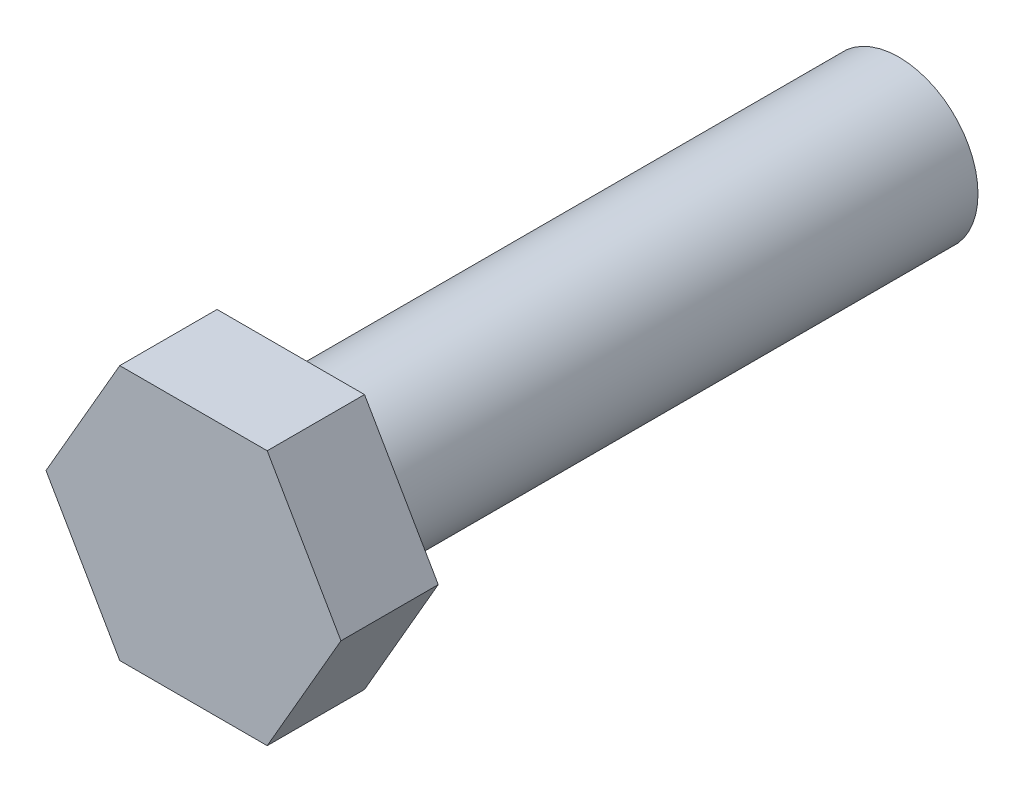
ISO-10303-21;
HEADER;
FILE_DESCRIPTION(('STEP AP214'),'2;1');
FILE_NAME('part.step','',(''),(''),'','','');
FILE_SCHEMA(('AUTOMOTIVE_DESIGN { 1 0 10303 214 1 1 1 1 }'));
ENDSEC;
DATA;
#1=APPLICATION_CONTEXT('core data for automotive mechanical design processes');
#2=APPLICATION_PROTOCOL_DEFINITION('international standard','automotive_design',2000,#1);
#3=PRODUCT_CONTEXT('',#1,'mechanical');
#4=PRODUCT('Part','Part','',(#3));
#5=PRODUCT_RELATED_PRODUCT_CATEGORY('part','',(#4));
#6=PRODUCT_DEFINITION_FORMATION('','',#4);
#7=PRODUCT_DEFINITION_CONTEXT('part definition',#1,'design');
#8=PRODUCT_DEFINITION('design','',#6,#7);
#9=PRODUCT_DEFINITION_SHAPE('','',#8);
#10=(LENGTH_UNIT() NAMED_UNIT(*) SI_UNIT(.MILLI.,.METRE.));
#11=(NAMED_UNIT(*) PLANE_ANGLE_UNIT() SI_UNIT($,.RADIAN.));
#12=(NAMED_UNIT(*) SI_UNIT($,.STERADIAN.) SOLID_ANGLE_UNIT());
#13=UNCERTAINTY_MEASURE_WITH_UNIT(LENGTH_MEASURE(1.E-05),#10,'distance_accuracy_value','');
#14=(GEOMETRIC_REPRESENTATION_CONTEXT(3) GLOBAL_UNCERTAINTY_ASSIGNED_CONTEXT((#13)) GLOBAL_UNIT_ASSIGNED_CONTEXT((#10,
#11,#12)) REPRESENTATION_CONTEXT('',''));
#15=CARTESIAN_POINT('',(0.,0.,0.));
#16=DIRECTION('',(0.,0.,1.));
#17=DIRECTION('',(1.,0.,0.));
#18=AXIS2_PLACEMENT_3D('',#15,#16,#17);
#19=CARTESIAN_POINT('',(15.3979316792873,-26.67,20.32));
#20=DIRECTION('',(-0.866025403784439,0.5,0.));
#21=DIRECTION('',(-0.5,-0.866025403784439,0.));
#22=AXIS2_PLACEMENT_3D('',#19,#20,#21);
#23=PLANE('',#22);
#24=DIRECTION('',(0.5,0.866025403784439,0.));
#25=VECTOR('',#24,1.);
#26=CARTESIAN_POINT('',(15.3979316792873,-26.67,0.));
#27=LINE('',#26,#25);
#28=CARTESIAN_POINT('',(15.3979316792873,-26.67,0.));
#29=VERTEX_POINT('',#28);
#30=CARTESIAN_POINT('',(30.7958633585746,0.,0.));
#31=VERTEX_POINT('',#30);
#32=EDGE_CURVE('E124',#29,#31,#27,.T.);
#33=ORIENTED_EDGE('',*,*,#32,.T.);
#34=DIRECTION('',(0.,0.,-1.));
#35=VECTOR('',#34,1.);
#36=CARTESIAN_POINT('',(30.7958633585746,0.,20.32));
#37=LINE('',#36,#35);
#38=CARTESIAN_POINT('',(30.7958633585746,0.,20.32));
#39=VERTEX_POINT('',#38);
#40=EDGE_CURVE('E47',#39,#31,#37,.T.);
#41=ORIENTED_EDGE('',*,*,#40,.F.);
#42=DIRECTION('',(0.5,0.866025403784439,0.));
#43=VECTOR('',#42,1.);
#44=CARTESIAN_POINT('',(15.3979316792873,-26.67,20.32));
#45=LINE('',#44,#43);
#46=CARTESIAN_POINT('',(15.3979316792873,-26.67,20.32));
#47=VERTEX_POINT('',#46);
#48=EDGE_CURVE('E135',#47,#39,#45,.T.);
#49=ORIENTED_EDGE('',*,*,#48,.F.);
#50=DIRECTION('',(0.,0.,-1.));
#51=VECTOR('',#50,1.);
#52=CARTESIAN_POINT('',(15.3979316792873,-26.67,20.32));
#53=LINE('',#52,#51);
#54=EDGE_CURVE('E120',#47,#29,#53,.T.);
#55=ORIENTED_EDGE('',*,*,#54,.T.);
#56=EDGE_LOOP('',(#33,#41,#49,#55));
#57=FACE_BOUND('',#56,.T.);
#58=ADVANCED_FACE('F39',(#57),#23,.F.);
#59=CARTESIAN_POINT('',(30.7958633585746,0.,20.32));
#60=DIRECTION('',(-0.866025403784439,-0.5,0.));
#61=DIRECTION('',(0.5,-0.866025403784438,0.));
#62=AXIS2_PLACEMENT_3D('',#59,#60,#61);
#63=PLANE('',#62);
#64=DIRECTION('',(-0.5,0.866025403784438,0.));
#65=VECTOR('',#64,1.);
#66=CARTESIAN_POINT('',(30.7958633585746,0.,0.));
#67=LINE('',#66,#65);
#68=CARTESIAN_POINT('',(15.3979316792873,26.67,0.));
#69=VERTEX_POINT('',#68);
#70=EDGE_CURVE('E127',#31,#69,#67,.T.);
#71=ORIENTED_EDGE('',*,*,#70,.T.);
#72=DIRECTION('',(0.,0.,-1.));
#73=VECTOR('',#72,1.);
#74=CARTESIAN_POINT('',(15.3979316792873,26.67,20.32));
#75=LINE('',#74,#73);
#76=CARTESIAN_POINT('',(15.3979316792873,26.67,20.32));
#77=VERTEX_POINT('',#76);
#78=EDGE_CURVE('E139',#77,#69,#75,.T.);
#79=ORIENTED_EDGE('',*,*,#78,.F.);
#80=DIRECTION('',(-0.5,0.866025403784438,0.));
#81=VECTOR('',#80,1.);
#82=CARTESIAN_POINT('',(30.7958633585746,0.,20.32));
#83=LINE('',#82,#81);
#84=EDGE_CURVE('E93',#39,#77,#83,.T.);
#85=ORIENTED_EDGE('',*,*,#84,.F.);
#86=ORIENTED_EDGE('',*,*,#40,.T.);
#87=EDGE_LOOP('',(#71,#79,#85,#86));
#88=FACE_BOUND('',#87,.T.);
#89=ADVANCED_FACE('F142',(#88),#63,.F.);
#90=CARTESIAN_POINT('',(15.3979316792873,26.67,20.32));
#91=DIRECTION('',(0.,-1.,0.));
#92=DIRECTION('',(0.,0.,-1.));
#93=AXIS2_PLACEMENT_3D('',#90,#91,#92);
#94=PLANE('',#93);
#95=DIRECTION('',(-1.,0.,0.));
#96=VECTOR('',#95,1.);
#97=CARTESIAN_POINT('',(15.3979316792873,26.67,0.));
#98=LINE('',#97,#96);
#99=CARTESIAN_POINT('',(-15.3979316792873,26.67,0.));
#100=VERTEX_POINT('',#99);
#101=EDGE_CURVE('E130',#69,#100,#98,.T.);
#102=ORIENTED_EDGE('',*,*,#101,.T.);
#103=DIRECTION('',(0.,0.,-1.));
#104=VECTOR('',#103,1.);
#105=CARTESIAN_POINT('',(-15.3979316792873,26.67,20.32));
#106=LINE('',#105,#104);
#107=CARTESIAN_POINT('',(-15.3979316792873,26.67,20.32));
#108=VERTEX_POINT('',#107);
#109=EDGE_CURVE('E115',#108,#100,#106,.T.);
#110=ORIENTED_EDGE('',*,*,#109,.F.);
#111=DIRECTION('',(-1.,0.,0.));
#112=VECTOR('',#111,1.);
#113=CARTESIAN_POINT('',(15.3979316792873,26.67,20.32));
#114=LINE('',#113,#112);
#115=EDGE_CURVE('E106',#77,#108,#114,.T.);
#116=ORIENTED_EDGE('',*,*,#115,.F.);
#117=ORIENTED_EDGE('',*,*,#78,.T.);
#118=EDGE_LOOP('',(#102,#110,#116,#117));
#119=FACE_BOUND('',#118,.T.);
#120=ADVANCED_FACE('F150',(#119),#94,.F.);
#121=CARTESIAN_POINT('',(-15.3979316792873,26.67,20.32));
#122=DIRECTION('',(0.866025403784439,-0.5,0.));
#123=DIRECTION('',(0.5,0.866025403784439,0.));
#124=AXIS2_PLACEMENT_3D('',#121,#122,#123);
#125=PLANE('',#124);
#126=DIRECTION('',(-0.5,-0.866025403784439,0.));
#127=VECTOR('',#126,1.);
#128=CARTESIAN_POINT('',(-15.3979316792873,26.67,0.));
#129=LINE('',#128,#127);
#130=CARTESIAN_POINT('',(-30.7958633585746,0.,0.));
#131=VERTEX_POINT('',#130);
#132=EDGE_CURVE('E114',#100,#131,#129,.T.);
#133=ORIENTED_EDGE('',*,*,#132,.T.);
#134=DIRECTION('',(0.,0.,-1.));
#135=VECTOR('',#134,1.);
#136=CARTESIAN_POINT('',(-30.7958633585746,0.,20.32));
#137=LINE('',#136,#135);
#138=CARTESIAN_POINT('',(-30.7958633585746,0.,20.32));
#139=VERTEX_POINT('',#138);
#140=EDGE_CURVE('E111',#139,#131,#137,.T.);
#141=ORIENTED_EDGE('',*,*,#140,.F.);
#142=DIRECTION('',(-0.5,-0.866025403784439,0.));
#143=VECTOR('',#142,1.);
#144=CARTESIAN_POINT('',(-15.3979316792873,26.67,20.32));
#145=LINE('',#144,#143);
#146=EDGE_CURVE('E100',#108,#139,#145,.T.);
#147=ORIENTED_EDGE('',*,*,#146,.F.);
#148=ORIENTED_EDGE('',*,*,#109,.T.);
#149=EDGE_LOOP('',(#133,#141,#147,#148));
#150=FACE_BOUND('',#149,.T.);
#151=ADVANCED_FACE('F112',(#150),#125,.F.);
#152=CARTESIAN_POINT('',(-30.7958633585746,0.,20.32));
#153=DIRECTION('',(0.866025403784439,0.5,0.));
#154=DIRECTION('',(-0.5,0.866025403784439,0.));
#155=AXIS2_PLACEMENT_3D('',#152,#153,#154);
#156=PLANE('',#155);
#157=DIRECTION('',(0.5,-0.866025403784439,0.));
#158=VECTOR('',#157,1.);
#159=CARTESIAN_POINT('',(-30.7958633585746,0.,0.));
#160=LINE('',#159,#158);
#161=CARTESIAN_POINT('',(-15.3979316792873,-26.67,0.));
#162=VERTEX_POINT('',#161);
#163=EDGE_CURVE('E78',#131,#162,#160,.T.);
#164=ORIENTED_EDGE('',*,*,#163,.T.);
#165=DIRECTION('',(0.,0.,-1.));
#166=VECTOR('',#165,1.);
#167=CARTESIAN_POINT('',(-15.3979316792873,-26.67,20.32));
#168=LINE('',#167,#166);
#169=CARTESIAN_POINT('',(-15.3979316792873,-26.67,20.32));
#170=VERTEX_POINT('',#169);
#171=EDGE_CURVE('E116',#170,#162,#168,.T.);
#172=ORIENTED_EDGE('',*,*,#171,.F.);
#173=DIRECTION('',(0.5,-0.866025403784439,0.));
#174=VECTOR('',#173,1.);
#175=CARTESIAN_POINT('',(-30.7958633585746,0.,20.32));
#176=LINE('',#175,#174);
#177=EDGE_CURVE('E104',#139,#170,#176,.T.);
#178=ORIENTED_EDGE('',*,*,#177,.F.);
#179=ORIENTED_EDGE('',*,*,#140,.T.);
#180=EDGE_LOOP('',(#164,#172,#178,#179));
#181=FACE_BOUND('',#180,.T.);
#182=ADVANCED_FACE('F118',(#181),#156,.F.);
#183=CARTESIAN_POINT('',(-15.3979316792873,-26.67,20.32));
#184=DIRECTION('',(0.,1.,0.));
#185=DIRECTION('',(-1.,0.,0.));
#186=AXIS2_PLACEMENT_3D('',#183,#184,#185);
#187=PLANE('',#186);
#188=DIRECTION('',(1.,0.,0.));
#189=VECTOR('',#188,1.);
#190=CARTESIAN_POINT('',(-15.3979316792873,-26.67,0.));
#191=LINE('',#190,#189);
#192=EDGE_CURVE('E84',#162,#29,#191,.T.);
#193=ORIENTED_EDGE('',*,*,#192,.T.);
#194=ORIENTED_EDGE('',*,*,#54,.F.);
#195=DIRECTION('',(1.,0.,0.));
#196=VECTOR('',#195,1.);
#197=CARTESIAN_POINT('',(-15.3979316792873,-26.67,20.32));
#198=LINE('',#197,#196);
#199=EDGE_CURVE('E55',#170,#47,#198,.T.);
#200=ORIENTED_EDGE('',*,*,#199,.F.);
#201=ORIENTED_EDGE('',*,*,#171,.T.);
#202=EDGE_LOOP('',(#193,#194,#200,#201));
#203=FACE_BOUND('',#202,.T.);
#204=ADVANCED_FACE('F170',(#203),#187,.F.);
#205=CARTESIAN_POINT('',(0.,0.,20.32));
#206=DIRECTION('',(0.,0.,1.));
#207=DIRECTION('',(1.,0.,0.));
#208=AXIS2_PLACEMENT_3D('',#205,#206,#207);
#209=PLANE('',#208);
#210=ORIENTED_EDGE('',*,*,#48,.T.);
#211=ORIENTED_EDGE('',*,*,#84,.T.);
#212=ORIENTED_EDGE('',*,*,#115,.T.);
#213=ORIENTED_EDGE('',*,*,#146,.T.);
#214=ORIENTED_EDGE('',*,*,#177,.T.);
#215=ORIENTED_EDGE('',*,*,#199,.T.);
#216=EDGE_LOOP('',(#210,#211,#212,#213,#214,#215));
#217=FACE_BOUND('',#216,.T.);
#218=ADVANCED_FACE('F102',(#217),#209,.T.);
#219=CARTESIAN_POINT('',(0.,0.,0.));
#220=DIRECTION('',(0.,0.,1.));
#221=DIRECTION('',(1.,0.,0.));
#222=AXIS2_PLACEMENT_3D('',#219,#220,#221);
#223=PLANE('',#222);
#224=CARTESIAN_POINT('',(0.,0.,0.));
#225=DIRECTION('',(0.,0.,1.));
#226=DIRECTION('',(1.,0.,0.));
#227=AXIS2_PLACEMENT_3D('',#224,#225,#226);
#228=CIRCLE('',#227,16.51);
#229=CARTESIAN_POINT('',(16.51,0.,0.));
#230=VERTEX_POINT('',#229);
#231=EDGE_CURVE('E11',#230,#230,#228,.F.);
#232=ORIENTED_EDGE('',*,*,#231,.F.);
#233=EDGE_LOOP('',(#232));
#234=FACE_BOUND('',#233,.T.);
#235=ORIENTED_EDGE('',*,*,#32,.F.);
#236=ORIENTED_EDGE('',*,*,#192,.F.);
#237=ORIENTED_EDGE('',*,*,#163,.F.);
#238=ORIENTED_EDGE('',*,*,#132,.F.);
#239=ORIENTED_EDGE('',*,*,#101,.F.);
#240=ORIENTED_EDGE('',*,*,#70,.F.);
#241=EDGE_LOOP('',(#235,#236,#237,#238,#239,#240));
#242=FACE_BOUND('',#241,.T.);
#243=ADVANCED_FACE('F147',(#234,#242),#223,.F.);
#244=CARTESIAN_POINT('',(0.,0.,-127.));
#245=DIRECTION('',(0.,0.,1.));
#246=DIRECTION('',(1.,0.,0.));
#247=AXIS2_PLACEMENT_3D('',#244,#245,#246);
#248=CYLINDRICAL_SURFACE('',#247,16.51);
#249=CARTESIAN_POINT('',(0.,0.,-127.));
#250=DIRECTION('',(0.,0.,-1.));
#251=DIRECTION('',(-1.,0.,0.));
#252=AXIS2_PLACEMENT_3D('',#249,#250,#251);
#253=CIRCLE('',#252,16.51);
#254=CARTESIAN_POINT('',(-16.51,0.,-127.));
#255=VERTEX_POINT('',#254);
#256=EDGE_CURVE('E128',#255,#255,#253,.T.);
#257=ORIENTED_EDGE('',*,*,#256,.F.);
#258=EDGE_LOOP('',(#257));
#259=FACE_BOUND('',#258,.T.);
#260=ORIENTED_EDGE('',*,*,#231,.T.);
#261=EDGE_LOOP('',(#260));
#262=FACE_BOUND('',#261,.T.);
#263=ADVANCED_FACE('F159',(#259,#262),#248,.T.);
#264=CARTESIAN_POINT('',(0.,0.,-127.));
#265=DIRECTION('',(0.,0.,-1.));
#266=DIRECTION('',(-1.,0.,0.));
#267=AXIS2_PLACEMENT_3D('',#264,#265,#266);
#268=PLANE('',#267);
#269=ORIENTED_EDGE('',*,*,#256,.T.);
#270=EDGE_LOOP('',(#269));
#271=FACE_BOUND('',#270,.T.);
#272=ADVANCED_FACE('F157',(#271),#268,.T.);
#273=CLOSED_SHELL('',(#58,#89,#120,#151,#182,#204,#218,#243,#263,#272));
#274=MANIFOLD_SOLID_BREP('B2',#273);
#275=ADVANCED_BREP_SHAPE_REPRESENTATION('',(#18,#274),#14);
#276=SHAPE_DEFINITION_REPRESENTATION(#9,#275);
ENDSEC;
END-ISO-10303-21;
